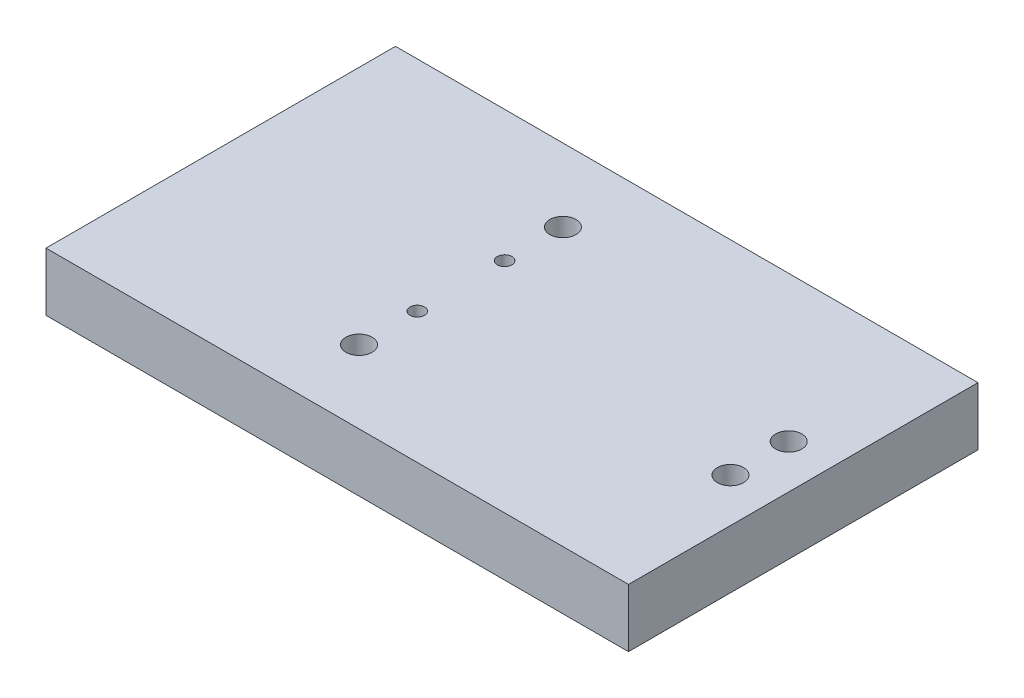
ISO-10303-21;
HEADER;
FILE_DESCRIPTION(('STEP AP214'),'2;1');
FILE_NAME('part.step','',(''),(''),'','','');
FILE_SCHEMA(('AUTOMOTIVE_DESIGN { 1 0 10303 214 1 1 1 1 }'));
ENDSEC;
DATA;
#1=APPLICATION_CONTEXT('core data for automotive mechanical design processes');
#2=APPLICATION_PROTOCOL_DEFINITION('international standard','automotive_design',2000,#1);
#3=PRODUCT_CONTEXT('',#1,'mechanical');
#4=PRODUCT('Part','Part','',(#3));
#5=PRODUCT_RELATED_PRODUCT_CATEGORY('part','',(#4));
#6=PRODUCT_DEFINITION_FORMATION('','',#4);
#7=PRODUCT_DEFINITION_CONTEXT('part definition',#1,'design');
#8=PRODUCT_DEFINITION('design','',#6,#7);
#9=PRODUCT_DEFINITION_SHAPE('','',#8);
#10=(LENGTH_UNIT() NAMED_UNIT(*) SI_UNIT(.MILLI.,.METRE.));
#11=(NAMED_UNIT(*) PLANE_ANGLE_UNIT() SI_UNIT($,.RADIAN.));
#12=(NAMED_UNIT(*) SI_UNIT($,.STERADIAN.) SOLID_ANGLE_UNIT());
#13=UNCERTAINTY_MEASURE_WITH_UNIT(LENGTH_MEASURE(1.E-05),#10,'distance_accuracy_value','');
#14=(GEOMETRIC_REPRESENTATION_CONTEXT(3) GLOBAL_UNCERTAINTY_ASSIGNED_CONTEXT((#13)) GLOBAL_UNIT_ASSIGNED_CONTEXT((#10,
#11,#12)) REPRESENTATION_CONTEXT('',''));
#15=CARTESIAN_POINT('',(0.,0.,0.));
#16=DIRECTION('',(0.,0.,1.));
#17=DIRECTION('',(1.,0.,0.));
#18=AXIS2_PLACEMENT_3D('',#15,#16,#17);
#19=CARTESIAN_POINT('',(-150.499530318051,-134.098300928345,60.));
#20=DIRECTION('',(1.,0.,0.));
#21=DIRECTION('',(0.,0.,-1.));
#22=AXIS2_PLACEMENT_3D('',#19,#20,#21);
#23=PLANE('',#22);
#24=DIRECTION('',(0.,-1.,0.));
#25=VECTOR('',#24,1.);
#26=CARTESIAN_POINT('',(-150.499530318051,-134.098300928345,-60.));
#27=LINE('',#26,#25);
#28=CARTESIAN_POINT('',(-150.499530318051,-114.098300928345,-60.));
#29=VERTEX_POINT('',#28);
#30=CARTESIAN_POINT('',(-150.499530318051,-134.098300928345,-60.));
#31=VERTEX_POINT('',#30);
#32=EDGE_CURVE('E141',#29,#31,#27,.T.);
#33=ORIENTED_EDGE('',*,*,#32,.T.);
#34=DIRECTION('',(0.,0.,-1.));
#35=VECTOR('',#34,1.);
#36=CARTESIAN_POINT('',(-150.499530318051,-134.098300928345,60.));
#37=LINE('',#36,#35);
#38=CARTESIAN_POINT('',(-150.499530318051,-134.098300928345,60.));
#39=VERTEX_POINT('',#38);
#40=EDGE_CURVE('E44',#39,#31,#37,.T.);
#41=ORIENTED_EDGE('',*,*,#40,.F.);
#42=DIRECTION('',(0.,-1.,0.));
#43=VECTOR('',#42,1.);
#44=CARTESIAN_POINT('',(-150.499530318051,-134.098300928345,60.));
#45=LINE('',#44,#43);
#46=CARTESIAN_POINT('',(-150.499530318051,-114.098300928345,60.));
#47=VERTEX_POINT('',#46);
#48=EDGE_CURVE('E133',#47,#39,#45,.T.);
#49=ORIENTED_EDGE('',*,*,#48,.F.);
#50=DIRECTION('',(0.,0.,-1.));
#51=VECTOR('',#50,1.);
#52=CARTESIAN_POINT('',(-150.499530318051,-114.098300928345,60.));
#53=LINE('',#52,#51);
#54=EDGE_CURVE('E11',#47,#29,#53,.T.);
#55=ORIENTED_EDGE('',*,*,#54,.T.);
#56=EDGE_LOOP('',(#33,#41,#49,#55));
#57=FACE_BOUND('',#56,.T.);
#58=ADVANCED_FACE('F35',(#57),#23,.F.);
#59=CARTESIAN_POINT('',(49.5004696819495,-134.098300928345,60.));
#60=DIRECTION('',(0.,1.,0.));
#61=DIRECTION('',(-1.,0.,0.));
#62=AXIS2_PLACEMENT_3D('',#59,#60,#61);
#63=PLANE('',#62);
#64=CARTESIAN_POINT('',(34.5004696819495,-134.098300928345,-10.));
#65=DIRECTION('',(0.,-1.,0.));
#66=DIRECTION('',(0.,0.,-1.));
#67=AXIS2_PLACEMENT_3D('',#64,#65,#66);
#68=CIRCLE('',#67,9.0055);
#69=CARTESIAN_POINT('',(34.5004696819495,-134.098300928345,-19.0055));
#70=VERTEX_POINT('',#69);
#71=EDGE_CURVE('E173',#70,#70,#68,.T.);
#72=ORIENTED_EDGE('',*,*,#71,.F.);
#73=EDGE_LOOP('',(#72));
#74=FACE_BOUND('',#73,.T.);
#75=CARTESIAN_POINT('',(34.5004696819495,-134.098300928345,10.));
#76=DIRECTION('',(0.,-1.,0.));
#77=DIRECTION('',(0.,0.,-1.));
#78=AXIS2_PLACEMENT_3D('',#75,#76,#77);
#79=CIRCLE('',#78,9.0055);
#80=CARTESIAN_POINT('',(34.5004696819495,-134.098300928345,0.994500000000001));
#81=VERTEX_POINT('',#80);
#82=EDGE_CURVE('E162',#81,#81,#79,.T.);
#83=ORIENTED_EDGE('',*,*,#82,.F.);
#84=EDGE_LOOP('',(#83));
#85=FACE_BOUND('',#84,.T.);
#86=CARTESIAN_POINT('',(-68.0295024719251,-134.098300928345,-35.));
#87=DIRECTION('',(0.,-1.,0.));
#88=DIRECTION('',(0.,0.,-1.));
#89=AXIS2_PLACEMENT_3D('',#86,#87,#88);
#90=CIRCLE('',#89,9.0055);
#91=CARTESIAN_POINT('',(-68.0295024719251,-134.098300928345,-44.0055));
#92=VERTEX_POINT('',#91);
#93=EDGE_CURVE('E113',#92,#92,#90,.T.);
#94=ORIENTED_EDGE('',*,*,#93,.F.);
#95=EDGE_LOOP('',(#94));
#96=FACE_BOUND('',#95,.T.);
#97=CARTESIAN_POINT('',(-68.0295024719251,-134.098300928345,35.));
#98=DIRECTION('',(0.,-1.,0.));
#99=DIRECTION('',(0.,0.,-1.));
#100=AXIS2_PLACEMENT_3D('',#97,#98,#99);
#101=CIRCLE('',#100,9.0055);
#102=CARTESIAN_POINT('',(-68.0295024719251,-134.098300928345,25.9945));
#103=VERTEX_POINT('',#102);
#104=EDGE_CURVE('E123',#103,#103,#101,.T.);
#105=ORIENTED_EDGE('',*,*,#104,.F.);
#106=EDGE_LOOP('',(#105));
#107=FACE_BOUND('',#106,.T.);
#108=DIRECTION('',(1.,0.,0.));
#109=VECTOR('',#108,1.);
#110=CARTESIAN_POINT('',(49.5004696819495,-134.098300928345,-60.));
#111=LINE('',#110,#109);
#112=CARTESIAN_POINT('',(49.5004696819495,-134.098300928345,-60.));
#113=VERTEX_POINT('',#112);
#114=EDGE_CURVE('E71',#31,#113,#111,.T.);
#115=ORIENTED_EDGE('',*,*,#114,.T.);
#116=DIRECTION('',(0.,0.,-1.));
#117=VECTOR('',#116,1.);
#118=CARTESIAN_POINT('',(49.5004696819495,-134.098300928345,60.));
#119=LINE('',#118,#117);
#120=CARTESIAN_POINT('',(49.5004696819495,-134.098300928345,60.));
#121=VERTEX_POINT('',#120);
#122=EDGE_CURVE('E147',#121,#113,#119,.T.);
#123=ORIENTED_EDGE('',*,*,#122,.F.);
#124=DIRECTION('',(1.,0.,0.));
#125=VECTOR('',#124,1.);
#126=CARTESIAN_POINT('',(49.5004696819495,-134.098300928345,60.));
#127=LINE('',#126,#125);
#128=EDGE_CURVE('E135',#39,#121,#127,.T.);
#129=ORIENTED_EDGE('',*,*,#128,.F.);
#130=ORIENTED_EDGE('',*,*,#40,.T.);
#131=EDGE_LOOP('',(#115,#123,#129,#130));
#132=FACE_BOUND('',#131,.T.);
#133=ADVANCED_FACE('F179',(#74,#85,#96,#107,#132),#63,.F.);
#134=CARTESIAN_POINT('',(49.5004696819495,-114.098300928345,60.));
#135=DIRECTION('',(-1.,0.,0.));
#136=DIRECTION('',(0.,0.,1.));
#137=AXIS2_PLACEMENT_3D('',#134,#135,#136);
#138=PLANE('',#137);
#139=DIRECTION('',(0.,1.,0.));
#140=VECTOR('',#139,1.);
#141=CARTESIAN_POINT('',(49.5004696819495,-114.098300928345,-60.));
#142=LINE('',#141,#140);
#143=CARTESIAN_POINT('',(49.5004696819495,-114.098300928345,-60.));
#144=VERTEX_POINT('',#143);
#145=EDGE_CURVE('E77',#113,#144,#142,.T.);
#146=ORIENTED_EDGE('',*,*,#145,.T.);
#147=DIRECTION('',(0.,0.,-1.));
#148=VECTOR('',#147,1.);
#149=CARTESIAN_POINT('',(49.5004696819495,-114.098300928345,60.));
#150=LINE('',#149,#148);
#151=CARTESIAN_POINT('',(49.5004696819495,-114.098300928345,60.));
#152=VERTEX_POINT('',#151);
#153=EDGE_CURVE('E140',#152,#144,#150,.T.);
#154=ORIENTED_EDGE('',*,*,#153,.F.);
#155=DIRECTION('',(0.,1.,0.));
#156=VECTOR('',#155,1.);
#157=CARTESIAN_POINT('',(49.5004696819495,-114.098300928345,60.));
#158=LINE('',#157,#156);
#159=EDGE_CURVE('E53',#121,#152,#158,.T.);
#160=ORIENTED_EDGE('',*,*,#159,.F.);
#161=ORIENTED_EDGE('',*,*,#122,.T.);
#162=EDGE_LOOP('',(#146,#154,#160,#161));
#163=FACE_BOUND('',#162,.T.);
#164=ADVANCED_FACE('F182',(#163),#138,.F.);
#165=CARTESIAN_POINT('',(0.,0.,-60.));
#166=DIRECTION('',(0.,0.,1.));
#167=DIRECTION('',(1.,0.,0.));
#168=AXIS2_PLACEMENT_3D('',#165,#166,#167);
#169=PLANE('',#168);
#170=ORIENTED_EDGE('',*,*,#32,.F.);
#171=DIRECTION('',(-1.,0.,0.));
#172=VECTOR('',#171,1.);
#173=CARTESIAN_POINT('',(-56.0295024719251,-114.098300928345,-60.));
#174=LINE('',#173,#172);
#175=EDGE_CURVE('E136',#144,#29,#174,.T.);
#176=ORIENTED_EDGE('',*,*,#175,.F.);
#177=ORIENTED_EDGE('',*,*,#145,.F.);
#178=ORIENTED_EDGE('',*,*,#114,.F.);
#179=EDGE_LOOP('',(#170,#176,#177,#178));
#180=FACE_BOUND('',#179,.T.);
#181=ADVANCED_FACE('F217',(#180),#169,.F.);
#182=CARTESIAN_POINT('',(0.,0.,60.));
#183=DIRECTION('',(0.,0.,1.));
#184=DIRECTION('',(1.,0.,0.));
#185=AXIS2_PLACEMENT_3D('',#182,#183,#184);
#186=PLANE('',#185);
#187=DIRECTION('',(-1.,0.,0.));
#188=VECTOR('',#187,1.);
#189=CARTESIAN_POINT('',(-56.0295024719251,-114.098300928345,60.));
#190=LINE('',#189,#188);
#191=EDGE_CURVE('E82',#152,#47,#190,.T.);
#192=ORIENTED_EDGE('',*,*,#191,.T.);
#193=ORIENTED_EDGE('',*,*,#48,.T.);
#194=ORIENTED_EDGE('',*,*,#128,.T.);
#195=ORIENTED_EDGE('',*,*,#159,.T.);
#196=EDGE_LOOP('',(#192,#193,#194,#195));
#197=FACE_BOUND('',#196,.T.);
#198=ADVANCED_FACE('F208',(#197),#186,.T.);
#199=CARTESIAN_POINT('',(-56.0295024719251,-114.098300928345,60.));
#200=DIRECTION('',(0.,-1.,0.));
#201=DIRECTION('',(0.,0.,-1.));
#202=AXIS2_PLACEMENT_3D('',#199,#200,#201);
#203=PLANE('',#202);
#204=CARTESIAN_POINT('',(34.5004696819495,-114.098300928345,-10.));
#205=DIRECTION('',(0.,-1.,0.));
#206=DIRECTION('',(0.,0.,-1.));
#207=AXIS2_PLACEMENT_3D('',#204,#205,#206);
#208=CIRCLE('',#207,4.49999999999999);
#209=CARTESIAN_POINT('',(34.5004696819495,-114.098300928345,-14.5));
#210=VERTEX_POINT('',#209);
#211=EDGE_CURVE('E38',#210,#210,#208,.T.);
#212=ORIENTED_EDGE('',*,*,#211,.T.);
#213=EDGE_LOOP('',(#212));
#214=FACE_BOUND('',#213,.T.);
#215=CARTESIAN_POINT('',(34.5004696819495,-114.098300928345,10.));
#216=DIRECTION('',(0.,-1.,0.));
#217=DIRECTION('',(0.,0.,-1.));
#218=AXIS2_PLACEMENT_3D('',#215,#216,#217);
#219=CIRCLE('',#218,4.49999999999999);
#220=CARTESIAN_POINT('',(34.5004696819495,-114.098300928345,5.50000000000001));
#221=VERTEX_POINT('',#220);
#222=EDGE_CURVE('E107',#221,#221,#219,.T.);
#223=ORIENTED_EDGE('',*,*,#222,.T.);
#224=EDGE_LOOP('',(#223));
#225=FACE_BOUND('',#224,.T.);
#226=CARTESIAN_POINT('',(-68.0295024719251,-114.098300928345,15.));
#227=DIRECTION('',(0.,1.,0.));
#228=DIRECTION('',(0.,0.,1.));
#229=AXIS2_PLACEMENT_3D('',#226,#227,#228);
#230=CIRCLE('',#229,2.5);
#231=CARTESIAN_POINT('',(-68.0295024719251,-114.098300928345,17.5));
#232=VERTEX_POINT('',#231);
#233=EDGE_CURVE('E101',#232,#232,#230,.T.);
#234=ORIENTED_EDGE('',*,*,#233,.F.);
#235=EDGE_LOOP('',(#234));
#236=FACE_BOUND('',#235,.T.);
#237=CARTESIAN_POINT('',(-68.0295024719251,-114.098300928345,-15.));
#238=DIRECTION('',(0.,1.,0.));
#239=DIRECTION('',(0.,0.,1.));
#240=AXIS2_PLACEMENT_3D('',#237,#238,#239);
#241=CIRCLE('',#240,2.5);
#242=CARTESIAN_POINT('',(-68.0295024719251,-114.098300928345,-12.5));
#243=VERTEX_POINT('',#242);
#244=EDGE_CURVE('E100',#243,#243,#241,.T.);
#245=ORIENTED_EDGE('',*,*,#244,.F.);
#246=EDGE_LOOP('',(#245));
#247=FACE_BOUND('',#246,.T.);
#248=CARTESIAN_POINT('',(-68.0295024719251,-114.098300928345,-35.));
#249=DIRECTION('',(0.,-1.,0.));
#250=DIRECTION('',(0.,0.,-1.));
#251=AXIS2_PLACEMENT_3D('',#248,#249,#250);
#252=CIRCLE('',#251,4.49999999999999);
#253=CARTESIAN_POINT('',(-68.0295024719251,-114.098300928345,-39.5));
#254=VERTEX_POINT('',#253);
#255=EDGE_CURVE('E122',#254,#254,#252,.T.);
#256=ORIENTED_EDGE('',*,*,#255,.T.);
#257=EDGE_LOOP('',(#256));
#258=FACE_BOUND('',#257,.T.);
#259=CARTESIAN_POINT('',(-68.0295024719251,-114.098300928345,35.));
#260=DIRECTION('',(0.,-1.,0.));
#261=DIRECTION('',(0.,0.,-1.));
#262=AXIS2_PLACEMENT_3D('',#259,#260,#261);
#263=CIRCLE('',#262,4.49999999999999);
#264=CARTESIAN_POINT('',(-68.0295024719251,-114.098300928345,30.5));
#265=VERTEX_POINT('',#264);
#266=EDGE_CURVE('E132',#265,#265,#263,.T.);
#267=ORIENTED_EDGE('',*,*,#266,.T.);
#268=EDGE_LOOP('',(#267));
#269=FACE_BOUND('',#268,.T.);
#270=ORIENTED_EDGE('',*,*,#54,.F.);
#271=ORIENTED_EDGE('',*,*,#191,.F.);
#272=ORIENTED_EDGE('',*,*,#153,.T.);
#273=ORIENTED_EDGE('',*,*,#175,.T.);
#274=EDGE_LOOP('',(#270,#271,#272,#273));
#275=FACE_BOUND('',#274,.T.);
#276=ADVANCED_FACE('F206',(#214,#225,#236,#247,#258,#269,#275),#203,.F.);
#277=CARTESIAN_POINT('',(-68.0295024719251,-134.098300928345,35.));
#278=DIRECTION('',(0.,-1.,0.));
#279=DIRECTION('',(0.,0.,-1.));
#280=AXIS2_PLACEMENT_3D('',#277,#278,#279);
#281=CYLINDRICAL_SURFACE('',#280,4.49999999999999);
#282=CARTESIAN_POINT('',(-68.0295024719251,-125.598300928345,35.));
#283=DIRECTION('',(0.,-1.,0.));
#284=DIRECTION('',(0.,0.,-1.));
#285=AXIS2_PLACEMENT_3D('',#282,#283,#284);
#286=CIRCLE('',#285,4.49999999999999);
#287=CARTESIAN_POINT('',(-68.0295024719251,-125.598300928345,30.5));
#288=VERTEX_POINT('',#287);
#289=EDGE_CURVE('E129',#288,#288,#286,.T.);
#290=ORIENTED_EDGE('',*,*,#289,.T.);
#291=EDGE_LOOP('',(#290));
#292=FACE_BOUND('',#291,.T.);
#293=ORIENTED_EDGE('',*,*,#266,.F.);
#294=EDGE_LOOP('',(#293));
#295=FACE_BOUND('',#294,.T.);
#296=ADVANCED_FACE('F202',(#292,#295),#281,.F.);
#297=CARTESIAN_POINT('',(-63.5295024719251,-125.598300928345,35.));
#298=DIRECTION('',(0.,1.,0.));
#299=DIRECTION('',(0.,0.,1.));
#300=AXIS2_PLACEMENT_3D('',#297,#298,#299);
#301=PLANE('',#300);
#302=ORIENTED_EDGE('',*,*,#289,.F.);
#303=EDGE_LOOP('',(#302));
#304=FACE_BOUND('',#303,.T.);
#305=CARTESIAN_POINT('',(-68.0295024719251,-125.598300928345,35.));
#306=DIRECTION('',(0.,-1.,0.));
#307=DIRECTION('',(0.,0.,-1.));
#308=AXIS2_PLACEMENT_3D('',#305,#306,#307);
#309=CIRCLE('',#308,9.0055);
#310=CARTESIAN_POINT('',(-68.0295024719251,-125.598300928345,25.9945));
#311=VERTEX_POINT('',#310);
#312=EDGE_CURVE('E126',#311,#311,#309,.T.);
#313=ORIENTED_EDGE('',*,*,#312,.T.);
#314=EDGE_LOOP('',(#313));
#315=FACE_BOUND('',#314,.T.);
#316=ADVANCED_FACE('F192',(#304,#315),#301,.F.);
#317=CARTESIAN_POINT('',(-68.0295024719251,-134.098300928345,35.));
#318=DIRECTION('',(0.,-1.,0.));
#319=DIRECTION('',(0.,0.,-1.));
#320=AXIS2_PLACEMENT_3D('',#317,#318,#319);
#321=CYLINDRICAL_SURFACE('',#320,9.0055);
#322=ORIENTED_EDGE('',*,*,#312,.F.);
#323=EDGE_LOOP('',(#322));
#324=FACE_BOUND('',#323,.T.);
#325=ORIENTED_EDGE('',*,*,#104,.T.);
#326=EDGE_LOOP('',(#325));
#327=FACE_BOUND('',#326,.T.);
#328=ADVANCED_FACE('F189',(#324,#327),#321,.F.);
#329=CARTESIAN_POINT('',(-68.0295024719251,-134.098300928345,-35.));
#330=DIRECTION('',(0.,-1.,0.));
#331=DIRECTION('',(0.,0.,-1.));
#332=AXIS2_PLACEMENT_3D('',#329,#330,#331);
#333=CYLINDRICAL_SURFACE('',#332,4.49999999999999);
#334=CARTESIAN_POINT('',(-68.0295024719251,-125.598300928345,-35.));
#335=DIRECTION('',(0.,-1.,0.));
#336=DIRECTION('',(0.,0.,-1.));
#337=AXIS2_PLACEMENT_3D('',#334,#335,#336);
#338=CIRCLE('',#337,4.49999999999999);
#339=CARTESIAN_POINT('',(-68.0295024719251,-125.598300928345,-39.5));
#340=VERTEX_POINT('',#339);
#341=EDGE_CURVE('E119',#340,#340,#338,.T.);
#342=ORIENTED_EDGE('',*,*,#341,.T.);
#343=EDGE_LOOP('',(#342));
#344=FACE_BOUND('',#343,.T.);
#345=ORIENTED_EDGE('',*,*,#255,.F.);
#346=EDGE_LOOP('',(#345));
#347=FACE_BOUND('',#346,.T.);
#348=ADVANCED_FACE('F191',(#344,#347),#333,.F.);
#349=CARTESIAN_POINT('',(-63.5295024719251,-125.598300928345,-35.));
#350=DIRECTION('',(0.,1.,0.));
#351=DIRECTION('',(0.,0.,1.));
#352=AXIS2_PLACEMENT_3D('',#349,#350,#351);
#353=PLANE('',#352);
#354=ORIENTED_EDGE('',*,*,#341,.F.);
#355=EDGE_LOOP('',(#354));
#356=FACE_BOUND('',#355,.T.);
#357=CARTESIAN_POINT('',(-68.0295024719251,-125.598300928345,-35.));
#358=DIRECTION('',(0.,-1.,0.));
#359=DIRECTION('',(0.,0.,-1.));
#360=AXIS2_PLACEMENT_3D('',#357,#358,#359);
#361=CIRCLE('',#360,9.0055);
#362=CARTESIAN_POINT('',(-68.0295024719251,-125.598300928345,-44.0055));
#363=VERTEX_POINT('',#362);
#364=EDGE_CURVE('E116',#363,#363,#361,.T.);
#365=ORIENTED_EDGE('',*,*,#364,.T.);
#366=EDGE_LOOP('',(#365));
#367=FACE_BOUND('',#366,.T.);
#368=ADVANCED_FACE('F199',(#356,#367),#353,.F.);
#369=CARTESIAN_POINT('',(-68.0295024719251,-134.098300928345,-35.));
#370=DIRECTION('',(0.,-1.,0.));
#371=DIRECTION('',(0.,0.,-1.));
#372=AXIS2_PLACEMENT_3D('',#369,#370,#371);
#373=CYLINDRICAL_SURFACE('',#372,9.0055);
#374=ORIENTED_EDGE('',*,*,#364,.F.);
#375=EDGE_LOOP('',(#374));
#376=FACE_BOUND('',#375,.T.);
#377=ORIENTED_EDGE('',*,*,#93,.T.);
#378=EDGE_LOOP('',(#377));
#379=FACE_BOUND('',#378,.T.);
#380=ADVANCED_FACE('F319',(#376,#379),#373,.F.);
#381=CARTESIAN_POINT('',(-68.0295024719251,-122.098300928345,-15.));
#382=DIRECTION('',(0.,1.,0.));
#383=DIRECTION('',(0.,0.,1.));
#384=AXIS2_PLACEMENT_3D('',#381,#382,#383);
#385=CONICAL_SURFACE('',#384,2.5,1.02974425867666);
#386=CARTESIAN_POINT('',(-68.0295024719251,-123.600452475914,-15.));
#387=VERTEX_POINT('',#386);
#388=VERTEX_LOOP('',#387);
#389=FACE_BOUND('',#388,.T.);
#390=CARTESIAN_POINT('',(-68.0295024719251,-122.098300928345,-15.));
#391=DIRECTION('',(0.,1.,0.));
#392=DIRECTION('',(0.,0.,1.));
#393=AXIS2_PLACEMENT_3D('',#390,#391,#392);
#394=CIRCLE('',#393,2.5);
#395=CARTESIAN_POINT('',(-68.0295024719251,-122.098300928345,-12.5));
#396=VERTEX_POINT('',#395);
#397=EDGE_CURVE('E104',#396,#396,#394,.T.);
#398=ORIENTED_EDGE('',*,*,#397,.T.);
#399=EDGE_LOOP('',(#398));
#400=FACE_BOUND('',#399,.T.);
#401=ADVANCED_FACE('F329',(#389,#400),#385,.F.);
#402=CARTESIAN_POINT('',(-68.0295024719251,-114.098300928345,-15.));
#403=DIRECTION('',(0.,1.,0.));
#404=DIRECTION('',(0.,0.,1.));
#405=AXIS2_PLACEMENT_3D('',#402,#403,#404);
#406=CYLINDRICAL_SURFACE('',#405,2.5);
#407=ORIENTED_EDGE('',*,*,#397,.F.);
#408=EDGE_LOOP('',(#407));
#409=FACE_BOUND('',#408,.T.);
#410=ORIENTED_EDGE('',*,*,#244,.T.);
#411=EDGE_LOOP('',(#410));
#412=FACE_BOUND('',#411,.T.);
#413=ADVANCED_FACE('F94',(#409,#412),#406,.F.);
#414=CARTESIAN_POINT('',(-68.0295024719251,-122.098300928345,15.));
#415=DIRECTION('',(0.,1.,0.));
#416=DIRECTION('',(0.,0.,1.));
#417=AXIS2_PLACEMENT_3D('',#414,#415,#416);
#418=CONICAL_SURFACE('',#417,2.5,1.02974425867666);
#419=CARTESIAN_POINT('',(-68.0295024719251,-123.600452475914,15.));
#420=VERTEX_POINT('',#419);
#421=VERTEX_LOOP('',#420);
#422=FACE_BOUND('',#421,.T.);
#423=CARTESIAN_POINT('',(-68.0295024719251,-122.098300928345,15.));
#424=DIRECTION('',(0.,1.,0.));
#425=DIRECTION('',(0.,0.,1.));
#426=AXIS2_PLACEMENT_3D('',#423,#424,#425);
#427=CIRCLE('',#426,2.5);
#428=CARTESIAN_POINT('',(-68.0295024719251,-122.098300928345,17.5));
#429=VERTEX_POINT('',#428);
#430=EDGE_CURVE('E98',#429,#429,#427,.T.);
#431=ORIENTED_EDGE('',*,*,#430,.T.);
#432=EDGE_LOOP('',(#431));
#433=FACE_BOUND('',#432,.T.);
#434=ADVANCED_FACE('F90',(#422,#433),#418,.F.);
#435=CARTESIAN_POINT('',(-68.0295024719251,-114.098300928345,15.));
#436=DIRECTION('',(0.,1.,0.));
#437=DIRECTION('',(0.,0.,1.));
#438=AXIS2_PLACEMENT_3D('',#435,#436,#437);
#439=CYLINDRICAL_SURFACE('',#438,2.5);
#440=ORIENTED_EDGE('',*,*,#430,.F.);
#441=EDGE_LOOP('',(#440));
#442=FACE_BOUND('',#441,.T.);
#443=ORIENTED_EDGE('',*,*,#233,.T.);
#444=EDGE_LOOP('',(#443));
#445=FACE_BOUND('',#444,.T.);
#446=ADVANCED_FACE('F93',(#442,#445),#439,.F.);
#447=CARTESIAN_POINT('',(34.5004696819495,-134.098300928345,10.));
#448=DIRECTION('',(0.,-1.,0.));
#449=DIRECTION('',(0.,0.,-1.));
#450=AXIS2_PLACEMENT_3D('',#447,#448,#449);
#451=CYLINDRICAL_SURFACE('',#450,4.49999999999999);
#452=CARTESIAN_POINT('',(34.5004696819495,-128.798300928345,10.));
#453=DIRECTION('',(0.,-1.,0.));
#454=DIRECTION('',(0.,0.,-1.));
#455=AXIS2_PLACEMENT_3D('',#452,#453,#454);
#456=CIRCLE('',#455,4.5);
#457=CARTESIAN_POINT('',(34.5004696819495,-128.798300928345,5.5));
#458=VERTEX_POINT('',#457);
#459=EDGE_CURVE('E154',#458,#458,#456,.T.);
#460=ORIENTED_EDGE('',*,*,#459,.T.);
#461=EDGE_LOOP('',(#460));
#462=FACE_BOUND('',#461,.T.);
#463=ORIENTED_EDGE('',*,*,#222,.F.);
#464=EDGE_LOOP('',(#463));
#465=FACE_BOUND('',#464,.T.);
#466=ADVANCED_FACE('F362',(#462,#465),#451,.F.);
#467=CARTESIAN_POINT('',(39.0004696819495,-128.798300928345,10.));
#468=DIRECTION('',(0.,1.,0.));
#469=DIRECTION('',(0.,0.,1.));
#470=AXIS2_PLACEMENT_3D('',#467,#468,#469);
#471=PLANE('',#470);
#472=ORIENTED_EDGE('',*,*,#459,.F.);
#473=EDGE_LOOP('',(#472));
#474=FACE_BOUND('',#473,.T.);
#475=CARTESIAN_POINT('',(34.5004696819495,-128.798300928345,10.));
#476=DIRECTION('',(0.,-1.,0.));
#477=DIRECTION('',(0.,0.,-1.));
#478=AXIS2_PLACEMENT_3D('',#475,#476,#477);
#479=CIRCLE('',#478,9.0055);
#480=CARTESIAN_POINT('',(34.5004696819495,-128.798300928345,0.994500000000001));
#481=VERTEX_POINT('',#480);
#482=EDGE_CURVE('E158',#481,#481,#479,.T.);
#483=ORIENTED_EDGE('',*,*,#482,.T.);
#484=EDGE_LOOP('',(#483));
#485=FACE_BOUND('',#484,.T.);
#486=ADVANCED_FACE('F372',(#474,#485),#471,.F.);
#487=CARTESIAN_POINT('',(34.5004696819495,-134.098300928345,10.));
#488=DIRECTION('',(0.,-1.,0.));
#489=DIRECTION('',(0.,0.,-1.));
#490=AXIS2_PLACEMENT_3D('',#487,#488,#489);
#491=CYLINDRICAL_SURFACE('',#490,9.0055);
#492=ORIENTED_EDGE('',*,*,#482,.F.);
#493=EDGE_LOOP('',(#492));
#494=FACE_BOUND('',#493,.T.);
#495=ORIENTED_EDGE('',*,*,#82,.T.);
#496=EDGE_LOOP('',(#495));
#497=FACE_BOUND('',#496,.T.);
#498=ADVANCED_FACE('F381',(#494,#497),#491,.F.);
#499=CARTESIAN_POINT('',(34.5004696819495,-134.098300928345,-10.));
#500=DIRECTION('',(0.,-1.,0.));
#501=DIRECTION('',(0.,0.,-1.));
#502=AXIS2_PLACEMENT_3D('',#499,#500,#501);
#503=CYLINDRICAL_SURFACE('',#502,4.49999999999999);
#504=CARTESIAN_POINT('',(34.5004696819495,-128.798300928345,-10.));
#505=DIRECTION('',(0.,-1.,0.));
#506=DIRECTION('',(0.,0.,-1.));
#507=AXIS2_PLACEMENT_3D('',#504,#505,#506);
#508=CIRCLE('',#507,4.5);
#509=CARTESIAN_POINT('',(34.5004696819495,-128.798300928345,-14.5));
#510=VERTEX_POINT('',#509);
#511=EDGE_CURVE('E167',#510,#510,#508,.T.);
#512=ORIENTED_EDGE('',*,*,#511,.T.);
#513=EDGE_LOOP('',(#512));
#514=FACE_BOUND('',#513,.T.);
#515=ORIENTED_EDGE('',*,*,#211,.F.);
#516=EDGE_LOOP('',(#515));
#517=FACE_BOUND('',#516,.T.);
#518=ADVANCED_FACE('F391',(#514,#517),#503,.F.);
#519=CARTESIAN_POINT('',(39.0004696819495,-128.798300928345,-10.));
#520=DIRECTION('',(0.,1.,0.));
#521=DIRECTION('',(0.,0.,1.));
#522=AXIS2_PLACEMENT_3D('',#519,#520,#521);
#523=PLANE('',#522);
#524=ORIENTED_EDGE('',*,*,#511,.F.);
#525=EDGE_LOOP('',(#524));
#526=FACE_BOUND('',#525,.T.);
#527=CARTESIAN_POINT('',(34.5004696819495,-128.798300928345,-10.));
#528=DIRECTION('',(0.,-1.,0.));
#529=DIRECTION('',(0.,0.,-1.));
#530=AXIS2_PLACEMENT_3D('',#527,#528,#529);
#531=CIRCLE('',#530,9.0055);
#532=CARTESIAN_POINT('',(34.5004696819495,-128.798300928345,-19.0055));
#533=VERTEX_POINT('',#532);
#534=EDGE_CURVE('E170',#533,#533,#531,.T.);
#535=ORIENTED_EDGE('',*,*,#534,.T.);
#536=EDGE_LOOP('',(#535));
#537=FACE_BOUND('',#536,.T.);
#538=ADVANCED_FACE('F401',(#526,#537),#523,.F.);
#539=CARTESIAN_POINT('',(34.5004696819495,-134.098300928345,-10.));
#540=DIRECTION('',(0.,-1.,0.));
#541=DIRECTION('',(0.,0.,-1.));
#542=AXIS2_PLACEMENT_3D('',#539,#540,#541);
#543=CYLINDRICAL_SURFACE('',#542,9.0055);
#544=ORIENTED_EDGE('',*,*,#534,.F.);
#545=EDGE_LOOP('',(#544));
#546=FACE_BOUND('',#545,.T.);
#547=ORIENTED_EDGE('',*,*,#71,.T.);
#548=EDGE_LOOP('',(#547));
#549=FACE_BOUND('',#548,.T.);
#550=ADVANCED_FACE('F177',(#546,#549),#543,.F.);
#551=CLOSED_SHELL('',(#58,#133,#164,#181,#198,#276,#296,#316,#328,#348,#368,#380,#401,#413,#434,
#446,#466,#486,#498,#518,#538,#550));
#552=MANIFOLD_SOLID_BREP('B2',#551);
#553=ADVANCED_BREP_SHAPE_REPRESENTATION('',(#18,#552),#14);
#554=SHAPE_DEFINITION_REPRESENTATION(#9,#553);
ENDSEC;
END-ISO-10303-21;
